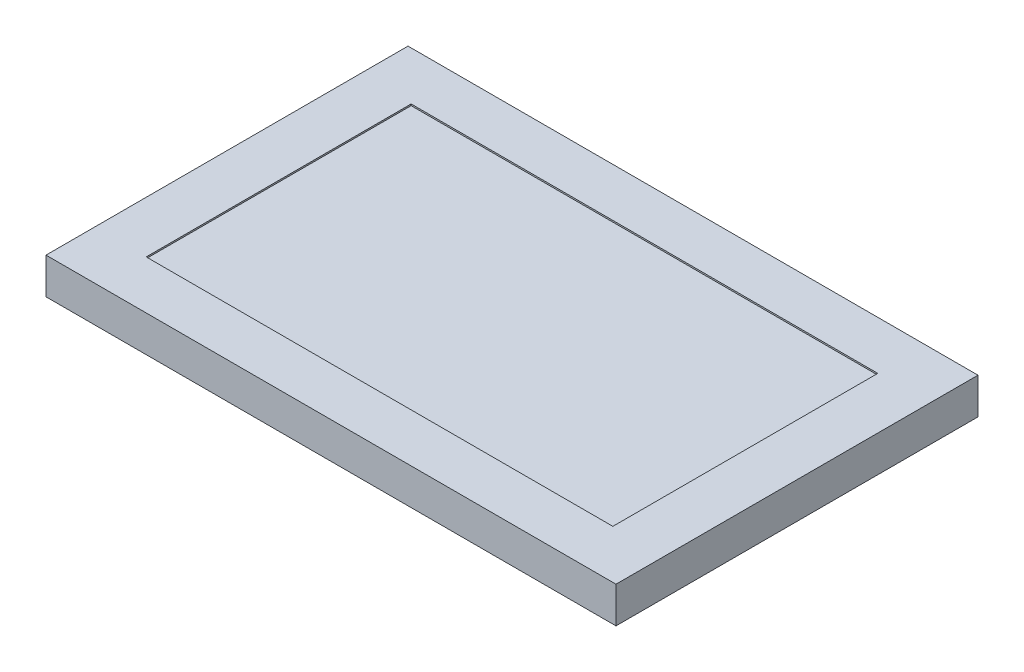
ISO-10303-21;
HEADER;
FILE_DESCRIPTION(('STEP AP214'),'2;1');
FILE_NAME('part.step','',(''),(''),'','','');
FILE_SCHEMA(('AUTOMOTIVE_DESIGN { 1 0 10303 214 1 1 1 1 }'));
ENDSEC;
DATA;
#1=APPLICATION_CONTEXT('core data for automotive mechanical design processes');
#2=APPLICATION_PROTOCOL_DEFINITION('international standard','automotive_design',2000,#1);
#3=PRODUCT_CONTEXT('',#1,'mechanical');
#4=PRODUCT('Part','Part','',(#3));
#5=PRODUCT_RELATED_PRODUCT_CATEGORY('part','',(#4));
#6=PRODUCT_DEFINITION_FORMATION('','',#4);
#7=PRODUCT_DEFINITION_CONTEXT('part definition',#1,'design');
#8=PRODUCT_DEFINITION('design','',#6,#7);
#9=PRODUCT_DEFINITION_SHAPE('','',#8);
#10=(LENGTH_UNIT() NAMED_UNIT(*) SI_UNIT(.MILLI.,.METRE.));
#11=(NAMED_UNIT(*) PLANE_ANGLE_UNIT() SI_UNIT($,.RADIAN.));
#12=(NAMED_UNIT(*) SI_UNIT($,.STERADIAN.) SOLID_ANGLE_UNIT());
#13=UNCERTAINTY_MEASURE_WITH_UNIT(LENGTH_MEASURE(1.E-05),#10,'distance_accuracy_value','');
#14=(GEOMETRIC_REPRESENTATION_CONTEXT(3) GLOBAL_UNCERTAINTY_ASSIGNED_CONTEXT((#13)) GLOBAL_UNIT_ASSIGNED_CONTEXT((#10,
#11,#12)) REPRESENTATION_CONTEXT('',''));
#15=CARTESIAN_POINT('',(0.,0.,0.));
#16=DIRECTION('',(0.,0.,1.));
#17=DIRECTION('',(1.,0.,0.));
#18=AXIS2_PLACEMENT_3D('',#15,#16,#17);
#19=CARTESIAN_POINT('',(-94.66,12.,-60.12));
#20=DIRECTION('',(1.,0.,0.));
#21=DIRECTION('',(0.,0.,-1.));
#22=AXIS2_PLACEMENT_3D('',#19,#20,#21);
#23=PLANE('',#22);
#24=DIRECTION('',(0.,0.,1.));
#25=VECTOR('',#24,1.);
#26=CARTESIAN_POINT('',(-94.66,0.,-60.12));
#27=LINE('',#26,#25);
#28=CARTESIAN_POINT('',(-94.66,0.,-60.12));
#29=VERTEX_POINT('',#28);
#30=CARTESIAN_POINT('',(-94.66,0.,60.12));
#31=VERTEX_POINT('',#30);
#32=EDGE_CURVE('E150',#29,#31,#27,.T.);
#33=ORIENTED_EDGE('',*,*,#32,.T.);
#34=DIRECTION('',(0.,-1.,0.));
#35=VECTOR('',#34,1.);
#36=CARTESIAN_POINT('',(-94.66,12.,60.12));
#37=LINE('',#36,#35);
#38=CARTESIAN_POINT('',(-94.66,12.,60.12));
#39=VERTEX_POINT('',#38);
#40=EDGE_CURVE('E11',#39,#31,#37,.T.);
#41=ORIENTED_EDGE('',*,*,#40,.F.);
#42=DIRECTION('',(0.,0.,1.));
#43=VECTOR('',#42,1.);
#44=CARTESIAN_POINT('',(-94.66,12.,-60.12));
#45=LINE('',#44,#43);
#46=CARTESIAN_POINT('',(-94.66,12.,-60.12));
#47=VERTEX_POINT('',#46);
#48=EDGE_CURVE('E151',#47,#39,#45,.T.);
#49=ORIENTED_EDGE('',*,*,#48,.F.);
#50=DIRECTION('',(0.,-1.,0.));
#51=VECTOR('',#50,1.);
#52=CARTESIAN_POINT('',(-94.66,12.,-60.12));
#53=LINE('',#52,#51);
#54=EDGE_CURVE('E160',#47,#29,#53,.T.);
#55=ORIENTED_EDGE('',*,*,#54,.T.);
#56=EDGE_LOOP('',(#33,#41,#49,#55));
#57=FACE_BOUND('',#56,.T.);
#58=ADVANCED_FACE('F39',(#57),#23,.F.);
#59=CARTESIAN_POINT('',(-94.66,12.,60.12));
#60=DIRECTION('',(0.,0.,-1.));
#61=DIRECTION('',(-1.,0.,0.));
#62=AXIS2_PLACEMENT_3D('',#59,#60,#61);
#63=PLANE('',#62);
#64=DIRECTION('',(1.,0.,0.));
#65=VECTOR('',#64,1.);
#66=CARTESIAN_POINT('',(-94.66,0.,60.12));
#67=LINE('',#66,#65);
#68=CARTESIAN_POINT('',(94.66,0.,60.12));
#69=VERTEX_POINT('',#68);
#70=EDGE_CURVE('E159',#31,#69,#67,.T.);
#71=ORIENTED_EDGE('',*,*,#70,.T.);
#72=DIRECTION('',(0.,-1.,0.));
#73=VECTOR('',#72,1.);
#74=CARTESIAN_POINT('',(94.66,12.,60.12));
#75=LINE('',#74,#73);
#76=CARTESIAN_POINT('',(94.66,12.,60.12));
#77=VERTEX_POINT('',#76);
#78=EDGE_CURVE('E46',#77,#69,#75,.T.);
#79=ORIENTED_EDGE('',*,*,#78,.F.);
#80=DIRECTION('',(1.,0.,0.));
#81=VECTOR('',#80,1.);
#82=CARTESIAN_POINT('',(-94.66,12.,60.12));
#83=LINE('',#82,#81);
#84=EDGE_CURVE('E89',#39,#77,#83,.T.);
#85=ORIENTED_EDGE('',*,*,#84,.F.);
#86=ORIENTED_EDGE('',*,*,#40,.T.);
#87=EDGE_LOOP('',(#71,#79,#85,#86));
#88=FACE_BOUND('',#87,.T.);
#89=ADVANCED_FACE('F186',(#88),#63,.F.);
#90=CARTESIAN_POINT('',(94.66,12.,-60.12));
#91=DIRECTION('',(-1.,0.,0.));
#92=DIRECTION('',(0.,0.,1.));
#93=AXIS2_PLACEMENT_3D('',#90,#91,#92);
#94=PLANE('',#93);
#95=DIRECTION('',(0.,0.,-1.));
#96=VECTOR('',#95,1.);
#97=CARTESIAN_POINT('',(94.66,0.,-60.12));
#98=LINE('',#97,#96);
#99=CARTESIAN_POINT('',(94.66,0.,-60.12));
#100=VERTEX_POINT('',#99);
#101=EDGE_CURVE('E165',#69,#100,#98,.T.);
#102=ORIENTED_EDGE('',*,*,#101,.T.);
#103=DIRECTION('',(0.,-1.,0.));
#104=VECTOR('',#103,1.);
#105=CARTESIAN_POINT('',(94.66,12.,-60.12));
#106=LINE('',#105,#104);
#107=CARTESIAN_POINT('',(94.66,12.,-60.12));
#108=VERTEX_POINT('',#107);
#109=EDGE_CURVE('E167',#108,#100,#106,.T.);
#110=ORIENTED_EDGE('',*,*,#109,.F.);
#111=DIRECTION('',(0.,0.,-1.));
#112=VECTOR('',#111,1.);
#113=CARTESIAN_POINT('',(94.66,12.,-60.12));
#114=LINE('',#113,#112);
#115=EDGE_CURVE('E152',#77,#108,#114,.T.);
#116=ORIENTED_EDGE('',*,*,#115,.F.);
#117=ORIENTED_EDGE('',*,*,#78,.T.);
#118=EDGE_LOOP('',(#102,#110,#116,#117));
#119=FACE_BOUND('',#118,.T.);
#120=ADVANCED_FACE('F173',(#119),#94,.F.);
#121=CARTESIAN_POINT('',(-94.66,12.,-60.12));
#122=DIRECTION('',(0.,0.,1.));
#123=DIRECTION('',(1.,0.,0.));
#124=AXIS2_PLACEMENT_3D('',#121,#122,#123);
#125=PLANE('',#124);
#126=DIRECTION('',(-1.,0.,0.));
#127=VECTOR('',#126,1.);
#128=CARTESIAN_POINT('',(-94.66,0.,-60.12));
#129=LINE('',#128,#127);
#130=EDGE_CURVE('E83',#100,#29,#129,.T.);
#131=ORIENTED_EDGE('',*,*,#130,.T.);
#132=ORIENTED_EDGE('',*,*,#54,.F.);
#133=DIRECTION('',(-1.,0.,0.));
#134=VECTOR('',#133,1.);
#135=CARTESIAN_POINT('',(-94.66,12.,-60.12));
#136=LINE('',#135,#134);
#137=EDGE_CURVE('E64',#108,#47,#136,.T.);
#138=ORIENTED_EDGE('',*,*,#137,.F.);
#139=ORIENTED_EDGE('',*,*,#109,.T.);
#140=EDGE_LOOP('',(#131,#132,#138,#139));
#141=FACE_BOUND('',#140,.T.);
#142=ADVANCED_FACE('F177',(#141),#125,.F.);
#143=CARTESIAN_POINT('',(0.,12.,0.));
#144=DIRECTION('',(0.,1.,0.));
#145=DIRECTION('',(0.,0.,1.));
#146=AXIS2_PLACEMENT_3D('',#143,#144,#145);
#147=PLANE('',#146);
#148=DIRECTION('',(0.,0.,1.));
#149=VECTOR('',#148,1.);
#150=CARTESIAN_POINT('',(-77.5,12.,-44.));
#151=LINE('',#150,#149);
#152=CARTESIAN_POINT('',(-77.5,12.,-44.));
#153=VERTEX_POINT('',#152);
#154=CARTESIAN_POINT('',(-77.5,12.,44.));
#155=VERTEX_POINT('',#154);
#156=EDGE_CURVE('E52',#153,#155,#151,.T.);
#157=ORIENTED_EDGE('',*,*,#156,.F.);
#158=DIRECTION('',(-1.,0.,0.));
#159=VECTOR('',#158,1.);
#160=CARTESIAN_POINT('',(-77.5,12.,-44.));
#161=LINE('',#160,#159);
#162=CARTESIAN_POINT('',(77.5,12.,-44.));
#163=VERTEX_POINT('',#162);
#164=EDGE_CURVE('E134',#163,#153,#161,.T.);
#165=ORIENTED_EDGE('',*,*,#164,.F.);
#166=DIRECTION('',(0.,0.,-1.));
#167=VECTOR('',#166,1.);
#168=CARTESIAN_POINT('',(77.5,12.,-44.));
#169=LINE('',#168,#167);
#170=CARTESIAN_POINT('',(77.5,12.,44.));
#171=VERTEX_POINT('',#170);
#172=EDGE_CURVE('E131',#171,#163,#169,.T.);
#173=ORIENTED_EDGE('',*,*,#172,.F.);
#174=DIRECTION('',(1.,0.,0.));
#175=VECTOR('',#174,1.);
#176=CARTESIAN_POINT('',(-77.5,12.,44.));
#177=LINE('',#176,#175);
#178=EDGE_CURVE('E143',#155,#171,#177,.T.);
#179=ORIENTED_EDGE('',*,*,#178,.F.);
#180=EDGE_LOOP('',(#157,#165,#173,#179));
#181=FACE_BOUND('',#180,.T.);
#182=ORIENTED_EDGE('',*,*,#48,.T.);
#183=ORIENTED_EDGE('',*,*,#84,.T.);
#184=ORIENTED_EDGE('',*,*,#115,.T.);
#185=ORIENTED_EDGE('',*,*,#137,.T.);
#186=EDGE_LOOP('',(#182,#183,#184,#185));
#187=FACE_BOUND('',#186,.T.);
#188=ADVANCED_FACE('F182',(#181,#187),#147,.T.);
#189=CARTESIAN_POINT('',(0.,0.,0.));
#190=DIRECTION('',(0.,1.,0.));
#191=DIRECTION('',(0.,0.,1.));
#192=AXIS2_PLACEMENT_3D('',#189,#190,#191);
#193=PLANE('',#192);
#194=ORIENTED_EDGE('',*,*,#32,.F.);
#195=ORIENTED_EDGE('',*,*,#130,.F.);
#196=ORIENTED_EDGE('',*,*,#101,.F.);
#197=ORIENTED_EDGE('',*,*,#70,.F.);
#198=EDGE_LOOP('',(#194,#195,#196,#197));
#199=FACE_BOUND('',#198,.T.);
#200=ADVANCED_FACE('F171',(#199),#193,.F.);
#201=CARTESIAN_POINT('',(-77.5,11.5,-44.));
#202=DIRECTION('',(-1.,0.,0.));
#203=DIRECTION('',(0.,0.,1.));
#204=AXIS2_PLACEMENT_3D('',#201,#202,#203);
#205=PLANE('',#204);
#206=ORIENTED_EDGE('',*,*,#156,.T.);
#207=DIRECTION('',(0.,1.,0.));
#208=VECTOR('',#207,1.);
#209=CARTESIAN_POINT('',(-77.5,11.5,44.));
#210=LINE('',#209,#208);
#211=CARTESIAN_POINT('',(-77.5,11.5,44.));
#212=VERTEX_POINT('',#211);
#213=EDGE_CURVE('E109',#212,#155,#210,.T.);
#214=ORIENTED_EDGE('',*,*,#213,.F.);
#215=DIRECTION('',(0.,0.,1.));
#216=VECTOR('',#215,1.);
#217=CARTESIAN_POINT('',(-77.5,11.5,-44.));
#218=LINE('',#217,#216);
#219=CARTESIAN_POINT('',(-77.5,11.5,-44.));
#220=VERTEX_POINT('',#219);
#221=EDGE_CURVE('E111',#220,#212,#218,.T.);
#222=ORIENTED_EDGE('',*,*,#221,.F.);
#223=DIRECTION('',(0.,1.,0.));
#224=VECTOR('',#223,1.);
#225=CARTESIAN_POINT('',(-77.5,11.5,-44.));
#226=LINE('',#225,#224);
#227=EDGE_CURVE('E144',#220,#153,#226,.T.);
#228=ORIENTED_EDGE('',*,*,#227,.T.);
#229=EDGE_LOOP('',(#206,#214,#222,#228));
#230=FACE_BOUND('',#229,.T.);
#231=ADVANCED_FACE('F115',(#230),#205,.F.);
#232=CARTESIAN_POINT('',(-77.5,11.5,-44.));
#233=DIRECTION('',(0.,0.,-1.));
#234=DIRECTION('',(-1.,0.,0.));
#235=AXIS2_PLACEMENT_3D('',#232,#233,#234);
#236=PLANE('',#235);
#237=ORIENTED_EDGE('',*,*,#164,.T.);
#238=ORIENTED_EDGE('',*,*,#227,.F.);
#239=DIRECTION('',(-1.,0.,0.));
#240=VECTOR('',#239,1.);
#241=CARTESIAN_POINT('',(-77.5,11.5,-44.));
#242=LINE('',#241,#240);
#243=CARTESIAN_POINT('',(77.5,11.5,-44.));
#244=VERTEX_POINT('',#243);
#245=EDGE_CURVE('E116',#244,#220,#242,.T.);
#246=ORIENTED_EDGE('',*,*,#245,.F.);
#247=DIRECTION('',(0.,1.,0.));
#248=VECTOR('',#247,1.);
#249=CARTESIAN_POINT('',(77.5,11.5,-44.));
#250=LINE('',#249,#248);
#251=EDGE_CURVE('E146',#244,#163,#250,.T.);
#252=ORIENTED_EDGE('',*,*,#251,.T.);
#253=EDGE_LOOP('',(#237,#238,#246,#252));
#254=FACE_BOUND('',#253,.T.);
#255=ADVANCED_FACE('F226',(#254),#236,.F.);
#256=CARTESIAN_POINT('',(77.5,11.5,-44.));
#257=DIRECTION('',(1.,0.,0.));
#258=DIRECTION('',(0.,0.,-1.));
#259=AXIS2_PLACEMENT_3D('',#256,#257,#258);
#260=PLANE('',#259);
#261=ORIENTED_EDGE('',*,*,#172,.T.);
#262=ORIENTED_EDGE('',*,*,#251,.F.);
#263=DIRECTION('',(0.,0.,-1.));
#264=VECTOR('',#263,1.);
#265=CARTESIAN_POINT('',(77.5,11.5,-44.));
#266=LINE('',#265,#264);
#267=CARTESIAN_POINT('',(77.5,11.5,44.));
#268=VERTEX_POINT('',#267);
#269=EDGE_CURVE('E126',#268,#244,#266,.T.);
#270=ORIENTED_EDGE('',*,*,#269,.F.);
#271=DIRECTION('',(0.,1.,0.));
#272=VECTOR('',#271,1.);
#273=CARTESIAN_POINT('',(77.5,11.5,44.));
#274=LINE('',#273,#272);
#275=EDGE_CURVE('E120',#268,#171,#274,.T.);
#276=ORIENTED_EDGE('',*,*,#275,.T.);
#277=EDGE_LOOP('',(#261,#262,#270,#276));
#278=FACE_BOUND('',#277,.T.);
#279=ADVANCED_FACE('F239',(#278),#260,.F.);
#280=CARTESIAN_POINT('',(-77.5,11.5,44.));
#281=DIRECTION('',(0.,0.,1.));
#282=DIRECTION('',(1.,0.,0.));
#283=AXIS2_PLACEMENT_3D('',#280,#281,#282);
#284=PLANE('',#283);
#285=ORIENTED_EDGE('',*,*,#178,.T.);
#286=ORIENTED_EDGE('',*,*,#275,.F.);
#287=DIRECTION('',(1.,0.,0.));
#288=VECTOR('',#287,1.);
#289=CARTESIAN_POINT('',(-77.5,11.5,44.));
#290=LINE('',#289,#288);
#291=EDGE_CURVE('E123',#212,#268,#290,.T.);
#292=ORIENTED_EDGE('',*,*,#291,.F.);
#293=ORIENTED_EDGE('',*,*,#213,.T.);
#294=EDGE_LOOP('',(#285,#286,#292,#293));
#295=FACE_BOUND('',#294,.T.);
#296=ADVANCED_FACE('F122',(#295),#284,.F.);
#297=CARTESIAN_POINT('',(0.,11.5,0.));
#298=DIRECTION('',(0.,1.,0.));
#299=DIRECTION('',(0.,0.,1.));
#300=AXIS2_PLACEMENT_3D('',#297,#298,#299);
#301=PLANE('',#300);
#302=ORIENTED_EDGE('',*,*,#221,.T.);
#303=ORIENTED_EDGE('',*,*,#291,.T.);
#304=ORIENTED_EDGE('',*,*,#269,.T.);
#305=ORIENTED_EDGE('',*,*,#245,.T.);
#306=EDGE_LOOP('',(#302,#303,#304,#305));
#307=FACE_BOUND('',#306,.T.);
#308=ADVANCED_FACE('F128',(#307),#301,.T.);
#309=CLOSED_SHELL('',(#58,#89,#120,#142,#188,#200,#231,#255,#279,#296,#308));
#310=MANIFOLD_SOLID_BREP('B2',#309);
#311=ADVANCED_BREP_SHAPE_REPRESENTATION('',(#18,#310),#14);
#312=SHAPE_DEFINITION_REPRESENTATION(#9,#311);
ENDSEC;
END-ISO-10303-21;
